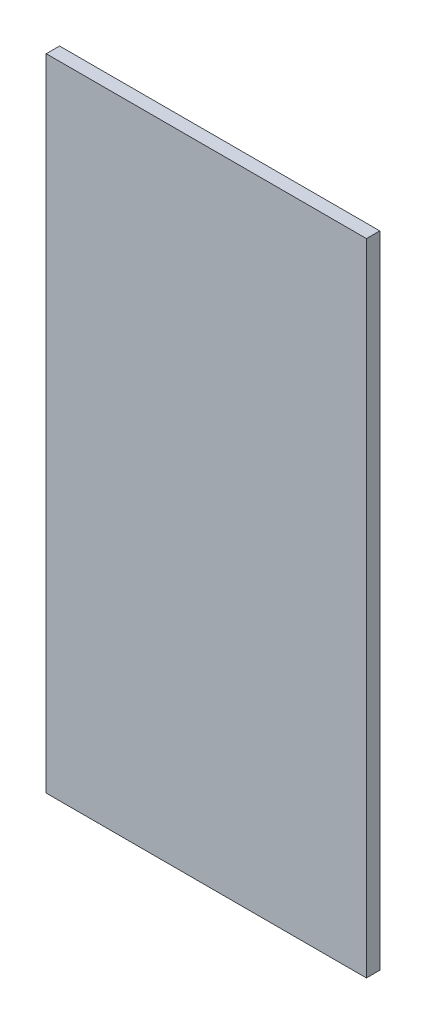
ISO-10303-21;
HEADER;
FILE_DESCRIPTION(('STEP AP214'),'2;1');
FILE_NAME('part.step','',(''),(''),'','','');
FILE_SCHEMA(('AUTOMOTIVE_DESIGN { 1 0 10303 214 1 1 1 1 }'));
ENDSEC;
DATA;
#1=APPLICATION_CONTEXT('core data for automotive mechanical design processes');
#2=APPLICATION_PROTOCOL_DEFINITION('international standard','automotive_design',2000,#1);
#3=PRODUCT_CONTEXT('',#1,'mechanical');
#4=PRODUCT('Part','Part','',(#3));
#5=PRODUCT_RELATED_PRODUCT_CATEGORY('part','',(#4));
#6=PRODUCT_DEFINITION_FORMATION('','',#4);
#7=PRODUCT_DEFINITION_CONTEXT('part definition',#1,'design');
#8=PRODUCT_DEFINITION('design','',#6,#7);
#9=PRODUCT_DEFINITION_SHAPE('','',#8);
#10=(LENGTH_UNIT() NAMED_UNIT(*) SI_UNIT(.MILLI.,.METRE.));
#11=(NAMED_UNIT(*) PLANE_ANGLE_UNIT() SI_UNIT($,.RADIAN.));
#12=(NAMED_UNIT(*) SI_UNIT($,.STERADIAN.) SOLID_ANGLE_UNIT());
#13=UNCERTAINTY_MEASURE_WITH_UNIT(LENGTH_MEASURE(1.E-05),#10,'distance_accuracy_value','');
#14=(GEOMETRIC_REPRESENTATION_CONTEXT(3) GLOBAL_UNCERTAINTY_ASSIGNED_CONTEXT((#13)) GLOBAL_UNIT_ASSIGNED_CONTEXT((#10,
#11,#12)) REPRESENTATION_CONTEXT('',''));
#15=CARTESIAN_POINT('',(0.,0.,0.));
#16=DIRECTION('',(0.,0.,1.));
#17=DIRECTION('',(1.,0.,0.));
#18=AXIS2_PLACEMENT_3D('',#15,#16,#17);
#19=CARTESIAN_POINT('',(0.,0.,-50.8));
#20=DIRECTION('',(-1.,0.,0.));
#21=DIRECTION('',(0.,0.,1.));
#22=AXIS2_PLACEMENT_3D('',#19,#20,#21);
#23=PLANE('',#22);
#24=DIRECTION('',(0.,-1.,0.));
#25=VECTOR('',#24,1.);
#26=CARTESIAN_POINT('',(0.,0.,0.));
#27=LINE('',#26,#25);
#28=CARTESIAN_POINT('',(0.,2438.4,0.));
#29=VERTEX_POINT('',#28);
#30=CARTESIAN_POINT('',(0.,0.,0.));
#31=VERTEX_POINT('',#30);
#32=EDGE_CURVE('E96',#29,#31,#27,.T.);
#33=ORIENTED_EDGE('',*,*,#32,.F.);
#34=DIRECTION('',(0.,0.,1.));
#35=VECTOR('',#34,1.);
#36=CARTESIAN_POINT('',(0.,2438.4,-50.8));
#37=LINE('',#36,#35);
#38=CARTESIAN_POINT('',(0.,2438.4,-50.8));
#39=VERTEX_POINT('',#38);
#40=EDGE_CURVE('E11',#39,#29,#37,.T.);
#41=ORIENTED_EDGE('',*,*,#40,.F.);
#42=DIRECTION('',(0.,-1.,0.));
#43=VECTOR('',#42,1.);
#44=CARTESIAN_POINT('',(0.,0.,-50.8));
#45=LINE('',#44,#43);
#46=CARTESIAN_POINT('',(0.,0.,-50.8));
#47=VERTEX_POINT('',#46);
#48=EDGE_CURVE('E90',#39,#47,#45,.T.);
#49=ORIENTED_EDGE('',*,*,#48,.T.);
#50=DIRECTION('',(0.,0.,1.));
#51=VECTOR('',#50,1.);
#52=CARTESIAN_POINT('',(0.,0.,-50.8));
#53=LINE('',#52,#51);
#54=EDGE_CURVE('E35',#47,#31,#53,.T.);
#55=ORIENTED_EDGE('',*,*,#54,.T.);
#56=EDGE_LOOP('',(#33,#41,#49,#55));
#57=FACE_BOUND('',#56,.T.);
#58=ADVANCED_FACE('F32',(#57),#23,.T.);
#59=CARTESIAN_POINT('',(0.,2438.4,-50.8));
#60=DIRECTION('',(0.,1.,0.));
#61=DIRECTION('',(0.,0.,1.));
#62=AXIS2_PLACEMENT_3D('',#59,#60,#61);
#63=PLANE('',#62);
#64=DIRECTION('',(-1.,0.,0.));
#65=VECTOR('',#64,1.);
#66=CARTESIAN_POINT('',(0.,2438.4,0.));
#67=LINE('',#66,#65);
#68=CARTESIAN_POINT('',(1219.2,2438.4,0.));
#69=VERTEX_POINT('',#68);
#70=EDGE_CURVE('E92',#69,#29,#67,.T.);
#71=ORIENTED_EDGE('',*,*,#70,.F.);
#72=DIRECTION('',(0.,0.,1.));
#73=VECTOR('',#72,1.);
#74=CARTESIAN_POINT('',(1219.2,2438.4,-50.8));
#75=LINE('',#74,#73);
#76=CARTESIAN_POINT('',(1219.2,2438.4,-50.8));
#77=VERTEX_POINT('',#76);
#78=EDGE_CURVE('E41',#77,#69,#75,.T.);
#79=ORIENTED_EDGE('',*,*,#78,.F.);
#80=DIRECTION('',(-1.,0.,0.));
#81=VECTOR('',#80,1.);
#82=CARTESIAN_POINT('',(0.,2438.4,-50.8));
#83=LINE('',#82,#81);
#84=EDGE_CURVE('E87',#77,#39,#83,.T.);
#85=ORIENTED_EDGE('',*,*,#84,.T.);
#86=ORIENTED_EDGE('',*,*,#40,.T.);
#87=EDGE_LOOP('',(#71,#79,#85,#86));
#88=FACE_BOUND('',#87,.T.);
#89=ADVANCED_FACE('F106',(#88),#63,.T.);
#90=CARTESIAN_POINT('',(1219.2,0.,-50.8));
#91=DIRECTION('',(1.,0.,0.));
#92=DIRECTION('',(0.,0.,-1.));
#93=AXIS2_PLACEMENT_3D('',#90,#91,#92);
#94=PLANE('',#93);
#95=DIRECTION('',(0.,1.,0.));
#96=VECTOR('',#95,1.);
#97=CARTESIAN_POINT('',(1219.2,0.,0.));
#98=LINE('',#97,#96);
#99=CARTESIAN_POINT('',(1219.2,0.,0.));
#100=VERTEX_POINT('',#99);
#101=EDGE_CURVE('E82',#100,#69,#98,.T.);
#102=ORIENTED_EDGE('',*,*,#101,.F.);
#103=DIRECTION('',(0.,0.,1.));
#104=VECTOR('',#103,1.);
#105=CARTESIAN_POINT('',(1219.2,0.,-50.8));
#106=LINE('',#105,#104);
#107=CARTESIAN_POINT('',(1219.2,0.,-50.8));
#108=VERTEX_POINT('',#107);
#109=EDGE_CURVE('E77',#108,#100,#106,.T.);
#110=ORIENTED_EDGE('',*,*,#109,.F.);
#111=DIRECTION('',(0.,1.,0.));
#112=VECTOR('',#111,1.);
#113=CARTESIAN_POINT('',(1219.2,0.,-50.8));
#114=LINE('',#113,#112);
#115=EDGE_CURVE('E80',#108,#77,#114,.T.);
#116=ORIENTED_EDGE('',*,*,#115,.T.);
#117=ORIENTED_EDGE('',*,*,#78,.T.);
#118=EDGE_LOOP('',(#102,#110,#116,#117));
#119=FACE_BOUND('',#118,.T.);
#120=ADVANCED_FACE('F79',(#119),#94,.T.);
#121=CARTESIAN_POINT('',(0.,0.,-50.8));
#122=DIRECTION('',(0.,-1.,0.));
#123=DIRECTION('',(0.,0.,-1.));
#124=AXIS2_PLACEMENT_3D('',#121,#122,#123);
#125=PLANE('',#124);
#126=DIRECTION('',(1.,0.,0.));
#127=VECTOR('',#126,1.);
#128=CARTESIAN_POINT('',(0.,0.,0.));
#129=LINE('',#128,#127);
#130=EDGE_CURVE('E99',#31,#100,#129,.T.);
#131=ORIENTED_EDGE('',*,*,#130,.F.);
#132=ORIENTED_EDGE('',*,*,#54,.F.);
#133=DIRECTION('',(1.,0.,0.));
#134=VECTOR('',#133,1.);
#135=CARTESIAN_POINT('',(0.,0.,-50.8));
#136=LINE('',#135,#134);
#137=EDGE_CURVE('E86',#47,#108,#136,.T.);
#138=ORIENTED_EDGE('',*,*,#137,.T.);
#139=ORIENTED_EDGE('',*,*,#109,.T.);
#140=EDGE_LOOP('',(#131,#132,#138,#139));
#141=FACE_BOUND('',#140,.T.);
#142=ADVANCED_FACE('F89',(#141),#125,.T.);
#143=CARTESIAN_POINT('',(0.,0.,-50.8));
#144=DIRECTION('',(0.,0.,-1.));
#145=DIRECTION('',(-1.,0.,0.));
#146=AXIS2_PLACEMENT_3D('',#143,#144,#145);
#147=PLANE('',#146);
#148=ORIENTED_EDGE('',*,*,#48,.F.);
#149=ORIENTED_EDGE('',*,*,#84,.F.);
#150=ORIENTED_EDGE('',*,*,#115,.F.);
#151=ORIENTED_EDGE('',*,*,#137,.F.);
#152=EDGE_LOOP('',(#148,#149,#150,#151));
#153=FACE_BOUND('',#152,.T.);
#154=ADVANCED_FACE('F85',(#153),#147,.T.);
#155=CARTESIAN_POINT('',(0.,0.,0.));
#156=DIRECTION('',(0.,0.,-1.));
#157=DIRECTION('',(-1.,0.,0.));
#158=AXIS2_PLACEMENT_3D('',#155,#156,#157);
#159=PLANE('',#158);
#160=ORIENTED_EDGE('',*,*,#32,.T.);
#161=ORIENTED_EDGE('',*,*,#130,.T.);
#162=ORIENTED_EDGE('',*,*,#101,.T.);
#163=ORIENTED_EDGE('',*,*,#70,.T.);
#164=EDGE_LOOP('',(#160,#161,#162,#163));
#165=FACE_BOUND('',#164,.T.);
#166=ADVANCED_FACE('F105',(#165),#159,.F.);
#167=CLOSED_SHELL('',(#58,#89,#120,#142,#154,#166));
#168=MANIFOLD_SOLID_BREP('B2',#167);
#169=ADVANCED_BREP_SHAPE_REPRESENTATION('',(#18,#168),#14);
#170=SHAPE_DEFINITION_REPRESENTATION(#9,#169);
ENDSEC;
END-ISO-10303-21;
